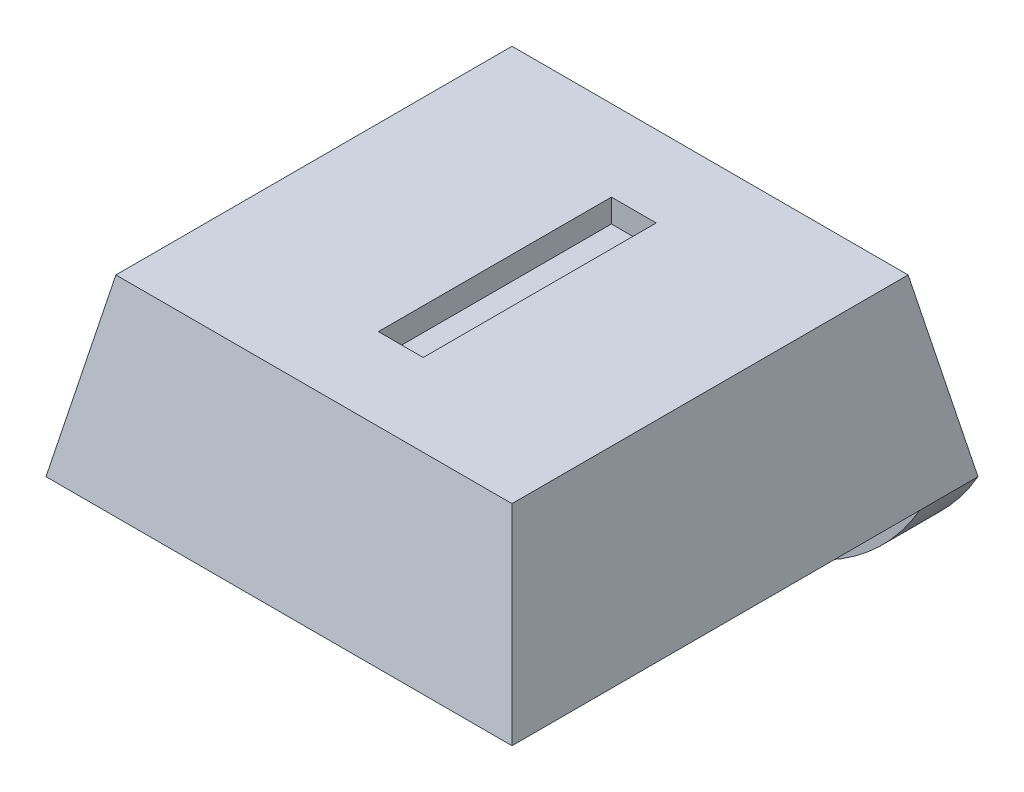
ISO-10303-21;
HEADER;
FILE_DESCRIPTION(('STEP AP214'),'2;1');
FILE_NAME('part.step','',(''),(''),'','','');
FILE_SCHEMA(('AUTOMOTIVE_DESIGN { 1 0 10303 214 1 1 1 1 }'));
ENDSEC;
DATA;
#1=APPLICATION_CONTEXT('core data for automotive mechanical design processes');
#2=APPLICATION_PROTOCOL_DEFINITION('international standard','automotive_design',2000,#1);
#3=PRODUCT_CONTEXT('',#1,'mechanical');
#4=PRODUCT('Part','Part','',(#3));
#5=PRODUCT_RELATED_PRODUCT_CATEGORY('part','',(#4));
#6=PRODUCT_DEFINITION_FORMATION('','',#4);
#7=PRODUCT_DEFINITION_CONTEXT('part definition',#1,'design');
#8=PRODUCT_DEFINITION('design','',#6,#7);
#9=PRODUCT_DEFINITION_SHAPE('','',#8);
#10=(LENGTH_UNIT() NAMED_UNIT(*) SI_UNIT(.MILLI.,.METRE.));
#11=(NAMED_UNIT(*) PLANE_ANGLE_UNIT() SI_UNIT($,.RADIAN.));
#12=(NAMED_UNIT(*) SI_UNIT($,.STERADIAN.) SOLID_ANGLE_UNIT());
#13=UNCERTAINTY_MEASURE_WITH_UNIT(LENGTH_MEASURE(1.E-05),#10,'distance_accuracy_value','');
#14=(GEOMETRIC_REPRESENTATION_CONTEXT(3) GLOBAL_UNCERTAINTY_ASSIGNED_CONTEXT((#13)) GLOBAL_UNIT_ASSIGNED_CONTEXT((#10,
#11,#12)) REPRESENTATION_CONTEXT('',''));
#15=CARTESIAN_POINT('',(0.,0.,0.));
#16=DIRECTION('',(0.,0.,1.));
#17=DIRECTION('',(1.,0.,0.));
#18=AXIS2_PLACEMENT_3D('',#15,#16,#17);
#19=CARTESIAN_POINT('',(0.,3.,0.));
#20=DIRECTION('',(0.,-1.,0.));
#21=DIRECTION('',(0.,0.,-1.));
#22=AXIS2_PLACEMENT_3D('',#19,#20,#21);
#23=PLANE('',#22);
#24=DIRECTION('',(-1.,0.,0.));
#25=VECTOR('',#24,1.);
#26=CARTESIAN_POINT('',(11.,3.,-0.6));
#27=LINE('',#26,#25);
#28=CARTESIAN_POINT('',(7.4,3.,-0.6));
#29=VERTEX_POINT('',#28);
#30=CARTESIAN_POINT('',(0.6,3.,-0.6));
#31=VERTEX_POINT('',#30);
#32=EDGE_CURVE('E180',#29,#31,#27,.T.);
#33=ORIENTED_EDGE('',*,*,#32,.F.);
#34=DIRECTION('',(0.,0.,1.));
#35=VECTOR('',#34,1.);
#36=CARTESIAN_POINT('',(7.4,3.,-8.));
#37=LINE('',#36,#35);
#38=CARTESIAN_POINT('',(7.4,3.,-7.4));
#39=VERTEX_POINT('',#38);
#40=EDGE_CURVE('E193',#39,#29,#37,.T.);
#41=ORIENTED_EDGE('',*,*,#40,.F.);
#42=DIRECTION('',(-1.,0.,0.));
#43=VECTOR('',#42,1.);
#44=CARTESIAN_POINT('',(11.,3.,-7.4));
#45=LINE('',#44,#43);
#46=CARTESIAN_POINT('',(0.599999999999999,3.,-7.4));
#47=VERTEX_POINT('',#46);
#48=EDGE_CURVE('E176',#39,#47,#45,.T.);
#49=ORIENTED_EDGE('',*,*,#48,.T.);
#50=DIRECTION('',(0.,0.,1.));
#51=VECTOR('',#50,1.);
#52=CARTESIAN_POINT('',(0.6,3.,-8.));
#53=LINE('',#52,#51);
#54=EDGE_CURVE('E196',#47,#31,#53,.T.);
#55=ORIENTED_EDGE('',*,*,#54,.T.);
#56=EDGE_LOOP('',(#33,#41,#49,#55));
#57=FACE_BOUND('',#56,.T.);
#58=DIRECTION('',(-1.,0.,0.));
#59=VECTOR('',#58,1.);
#60=CARTESIAN_POINT('',(4.46507003644335,3.,-2.0105672247147));
#61=LINE('',#60,#59);
#62=CARTESIAN_POINT('',(4.46507003644335,3.,-2.0105672247147));
#63=VERTEX_POINT('',#62);
#64=CARTESIAN_POINT('',(3.69583926721259,3.,-2.0105672247147));
#65=VERTEX_POINT('',#64);
#66=EDGE_CURVE('E58',#63,#65,#61,.T.);
#67=ORIENTED_EDGE('',*,*,#66,.T.);
#68=DIRECTION('',(0.,0.,-1.));
#69=VECTOR('',#68,1.);
#70=CARTESIAN_POINT('',(3.69583926721259,3.,-2.0105672247147));
#71=LINE('',#70,#69);
#72=CARTESIAN_POINT('',(3.69583926721259,3.,-6.0105672247147));
#73=VERTEX_POINT('',#72);
#74=EDGE_CURVE('E148',#65,#73,#71,.T.);
#75=ORIENTED_EDGE('',*,*,#74,.T.);
#76=DIRECTION('',(1.,0.,0.));
#77=VECTOR('',#76,1.);
#78=CARTESIAN_POINT('',(3.69583926721259,3.,-6.0105672247147));
#79=LINE('',#78,#77);
#80=CARTESIAN_POINT('',(4.46507003644335,3.,-6.0105672247147));
#81=VERTEX_POINT('',#80);
#82=EDGE_CURVE('E475',#73,#81,#79,.T.);
#83=ORIENTED_EDGE('',*,*,#82,.T.);
#84=DIRECTION('',(0.,0.,1.));
#85=VECTOR('',#84,1.);
#86=CARTESIAN_POINT('',(4.46507003644335,3.,-6.0105672247147));
#87=LINE('',#86,#85);
#88=EDGE_CURVE('E144',#81,#63,#87,.T.);
#89=ORIENTED_EDGE('',*,*,#88,.T.);
#90=EDGE_LOOP('',(#67,#75,#83,#89));
#91=FACE_BOUND('',#90,.T.);
#92=ADVANCED_FACE('F42',(#57,#91),#23,.F.);
#93=CARTESIAN_POINT('',(8.,0.,-8.));
#94=DIRECTION('',(-0.98058067569092,-0.196116135138184,0.));
#95=DIRECTION('',(0.196116135138184,-0.98058067569092,0.));
#96=AXIS2_PLACEMENT_3D('',#93,#94,#95);
#97=PLANE('',#96);
#98=DIRECTION('',(-0.192450089729875,0.962250448649376,-0.192450089729875));
#99=VECTOR('',#98,1.);
#100=CARTESIAN_POINT('',(7.7037037037037,1.48148148148148,-0.296296296296296));
#101=LINE('',#100,#99);
#102=CARTESIAN_POINT('',(8.,0.,0.));
#103=VERTEX_POINT('',#102);
#104=EDGE_CURVE('E190',#103,#29,#101,.T.);
#105=ORIENTED_EDGE('',*,*,#104,.F.);
#106=DIRECTION('',(0.,0.,-1.));
#107=VECTOR('',#106,1.);
#108=CARTESIAN_POINT('',(8.,0.,0.));
#109=LINE('',#108,#107);
#110=CARTESIAN_POINT('',(8.,0.,-7.));
#111=VERTEX_POINT('',#110);
#112=EDGE_CURVE('E209',#103,#111,#109,.T.);
#113=ORIENTED_EDGE('',*,*,#112,.T.);
#114=DIRECTION('',(0.,0.,1.));
#115=VECTOR('',#114,1.);
#116=CARTESIAN_POINT('',(8.,0.,-8.));
#117=LINE('',#116,#115);
#118=CARTESIAN_POINT('',(8.,0.,-8.));
#119=VERTEX_POINT('',#118);
#120=EDGE_CURVE('E150',#119,#111,#117,.T.);
#121=ORIENTED_EDGE('',*,*,#120,.F.);
#122=DIRECTION('',(0.192450089729875,-0.962250448649376,-0.192450089729875));
#123=VECTOR('',#122,1.);
#124=CARTESIAN_POINT('',(8.,0.,-8.));
#125=LINE('',#124,#123);
#126=EDGE_CURVE('E183',#39,#119,#125,.T.);
#127=ORIENTED_EDGE('',*,*,#126,.F.);
#128=ORIENTED_EDGE('',*,*,#40,.T.);
#129=EDGE_LOOP('',(#105,#113,#121,#127,#128));
#130=FACE_BOUND('',#129,.T.);
#131=ADVANCED_FACE('F277',(#130),#97,.F.);
#132=CARTESIAN_POINT('',(0.,0.,-8.));
#133=DIRECTION('',(0.98058067569092,-0.196116135138184,0.));
#134=DIRECTION('',(0.196116135138184,0.98058067569092,0.));
#135=AXIS2_PLACEMENT_3D('',#132,#133,#134);
#136=PLANE('',#135);
#137=DIRECTION('',(-0.192450089729875,-0.962250448649376,0.192450089729875));
#138=VECTOR('',#137,1.);
#139=CARTESIAN_POINT('',(0.296296296296296,1.48148148148148,-0.296296296296296));
#140=LINE('',#139,#138);
#141=CARTESIAN_POINT('',(0.,0.,0.));
#142=VERTEX_POINT('',#141);
#143=EDGE_CURVE('E237',#31,#142,#140,.T.);
#144=ORIENTED_EDGE('',*,*,#143,.F.);
#145=ORIENTED_EDGE('',*,*,#54,.F.);
#146=DIRECTION('',(0.192450089729875,0.962250448649376,0.192450089729875));
#147=VECTOR('',#146,1.);
#148=CARTESIAN_POINT('',(0.,0.,-8.));
#149=LINE('',#148,#147);
#150=CARTESIAN_POINT('',(0.,0.,-8.));
#151=VERTEX_POINT('',#150);
#152=EDGE_CURVE('E208',#151,#47,#149,.T.);
#153=ORIENTED_EDGE('',*,*,#152,.F.);
#154=DIRECTION('',(0.,0.,1.));
#155=VECTOR('',#154,1.);
#156=CARTESIAN_POINT('',(0.,0.,0.));
#157=LINE('',#156,#155);
#158=CARTESIAN_POINT('',(0.,0.,-7.));
#159=VERTEX_POINT('',#158);
#160=EDGE_CURVE('E213',#151,#159,#157,.T.);
#161=ORIENTED_EDGE('',*,*,#160,.T.);
#162=EDGE_CURVE('E200',#159,#142,#157,.T.);
#163=ORIENTED_EDGE('',*,*,#162,.T.);
#164=EDGE_LOOP('',(#144,#145,#153,#161,#163));
#165=FACE_BOUND('',#164,.T.);
#166=ADVANCED_FACE('F261',(#165),#136,.F.);
#167=CARTESIAN_POINT('',(0.,0.,0.));
#168=DIRECTION('',(0.,-1.,0.));
#169=DIRECTION('',(0.,0.,-1.));
#170=AXIS2_PLACEMENT_3D('',#167,#168,#169);
#171=PLANE('',#170);
#172=DIRECTION('',(-1.,0.,0.));
#173=VECTOR('',#172,1.);
#174=CARTESIAN_POINT('',(0.,0.,-7.));
#175=LINE('',#174,#173);
#176=EDGE_CURVE('E156',#111,#159,#175,.T.);
#177=ORIENTED_EDGE('',*,*,#176,.F.);
#178=ORIENTED_EDGE('',*,*,#112,.F.);
#179=DIRECTION('',(1.,0.,0.));
#180=VECTOR('',#179,1.);
#181=CARTESIAN_POINT('',(0.,0.,0.));
#182=LINE('',#181,#180);
#183=EDGE_CURVE('E210',#142,#103,#182,.T.);
#184=ORIENTED_EDGE('',*,*,#183,.F.);
#185=ORIENTED_EDGE('',*,*,#162,.F.);
#186=EDGE_LOOP('',(#177,#178,#184,#185));
#187=FACE_BOUND('',#186,.T.);
#188=CARTESIAN_POINT('',(4.,0.,-3.75));
#189=DIRECTION('',(0.,-1.,0.));
#190=DIRECTION('',(0.,0.,-1.));
#191=AXIS2_PLACEMENT_3D('',#188,#189,#190);
#192=CIRCLE('',#191,1.8);
#193=CARTESIAN_POINT('',(4.,0.,-5.55));
#194=VERTEX_POINT('',#193);
#195=EDGE_CURVE('E168',#194,#194,#192,.T.);
#196=ORIENTED_EDGE('',*,*,#195,.F.);
#197=EDGE_LOOP('',(#196));
#198=FACE_BOUND('',#197,.T.);
#199=ADVANCED_FACE('F272',(#187,#198),#171,.T.);
#200=CARTESIAN_POINT('',(11.,3.,-7.4));
#201=DIRECTION('',(0.,0.196116135138184,-0.98058067569092));
#202=DIRECTION('',(0.,0.98058067569092,0.196116135138184));
#203=AXIS2_PLACEMENT_3D('',#200,#201,#202);
#204=PLANE('',#203);
#205=ORIENTED_EDGE('',*,*,#126,.T.);
#206=DIRECTION('',(-1.,0.,0.));
#207=VECTOR('',#206,1.);
#208=CARTESIAN_POINT('',(0.,0.,-8.));
#209=LINE('',#208,#207);
#210=EDGE_CURVE('E204',#119,#151,#209,.T.);
#211=ORIENTED_EDGE('',*,*,#210,.T.);
#212=ORIENTED_EDGE('',*,*,#152,.T.);
#213=ORIENTED_EDGE('',*,*,#48,.F.);
#214=EDGE_LOOP('',(#205,#211,#212,#213));
#215=FACE_BOUND('',#214,.T.);
#216=ADVANCED_FACE('F256',(#215),#204,.T.);
#217=CARTESIAN_POINT('',(11.,0.,0.));
#218=DIRECTION('',(0.,0.196116135138184,0.98058067569092));
#219=DIRECTION('',(0.,-0.98058067569092,0.196116135138184));
#220=AXIS2_PLACEMENT_3D('',#217,#218,#219);
#221=PLANE('',#220);
#222=ORIENTED_EDGE('',*,*,#104,.T.);
#223=ORIENTED_EDGE('',*,*,#32,.T.);
#224=ORIENTED_EDGE('',*,*,#143,.T.);
#225=ORIENTED_EDGE('',*,*,#183,.T.);
#226=EDGE_LOOP('',(#222,#223,#224,#225));
#227=FACE_BOUND('',#226,.T.);
#228=ADVANCED_FACE('F303',(#227),#221,.T.);
#229=CARTESIAN_POINT('',(4.,0.8,-3.75));
#230=DIRECTION('',(0.,-1.,0.));
#231=DIRECTION('',(0.,0.,-1.));
#232=AXIS2_PLACEMENT_3D('',#229,#230,#231);
#233=CYLINDRICAL_SURFACE('',#232,1.8);
#234=CARTESIAN_POINT('',(4.,0.8,-3.75));
#235=DIRECTION('',(0.,-1.,0.));
#236=DIRECTION('',(0.,0.,-1.));
#237=AXIS2_PLACEMENT_3D('',#234,#235,#236);
#238=CIRCLE('',#237,1.8);
#239=CARTESIAN_POINT('',(4.,0.8,-5.55));
#240=VERTEX_POINT('',#239);
#241=EDGE_CURVE('E172',#240,#240,#238,.T.);
#242=ORIENTED_EDGE('',*,*,#241,.F.);
#243=EDGE_LOOP('',(#242));
#244=FACE_BOUND('',#243,.T.);
#245=ORIENTED_EDGE('',*,*,#195,.T.);
#246=EDGE_LOOP('',(#245));
#247=FACE_BOUND('',#246,.T.);
#248=ADVANCED_FACE('F310',(#244,#247),#233,.F.);
#249=CARTESIAN_POINT('',(4.,0.8,-3.75));
#250=DIRECTION('',(0.,-1.,0.));
#251=DIRECTION('',(0.,0.,-1.));
#252=AXIS2_PLACEMENT_3D('',#249,#250,#251);
#253=PLANE('',#252);
#254=ORIENTED_EDGE('',*,*,#241,.T.);
#255=EDGE_LOOP('',(#254));
#256=FACE_BOUND('',#255,.T.);
#257=ADVANCED_FACE('F314',(#256),#253,.T.);
#258=CARTESIAN_POINT('',(0.,-2.,-8.));
#259=DIRECTION('',(0.,0.,1.));
#260=DIRECTION('',(1.,0.,0.));
#261=AXIS2_PLACEMENT_3D('',#258,#259,#260);
#262=PLANE('',#261);
#263=ORIENTED_EDGE('',*,*,#210,.F.);
#264=CARTESIAN_POINT('',(4.53589838486225,2.,-8.));
#265=DIRECTION('',(0.,0.,1.));
#266=DIRECTION('',(1.,0.,0.));
#267=AXIS2_PLACEMENT_3D('',#264,#265,#266);
#268=CIRCLE('',#267,4.);
#269=CARTESIAN_POINT('',(4.53589838486225,-2.,-8.));
#270=VERTEX_POINT('',#269);
#271=EDGE_CURVE('E11',#119,#270,#268,.F.);
#272=ORIENTED_EDGE('',*,*,#271,.T.);
#273=DIRECTION('',(1.,0.,0.));
#274=VECTOR('',#273,1.);
#275=CARTESIAN_POINT('',(0.,-2.,-8.));
#276=LINE('',#275,#274);
#277=CARTESIAN_POINT('',(3.46410161513775,-2.,-8.));
#278=VERTEX_POINT('',#277);
#279=EDGE_CURVE('E162',#278,#270,#276,.T.);
#280=ORIENTED_EDGE('',*,*,#279,.F.);
#281=CARTESIAN_POINT('',(3.46410161513775,2.,-8.));
#282=DIRECTION('',(0.,0.,1.));
#283=DIRECTION('',(1.,0.,0.));
#284=AXIS2_PLACEMENT_3D('',#281,#282,#283);
#285=CIRCLE('',#284,4.);
#286=EDGE_CURVE('E51',#278,#151,#285,.F.);
#287=ORIENTED_EDGE('',*,*,#286,.T.);
#288=EDGE_LOOP('',(#263,#272,#280,#287));
#289=FACE_BOUND('',#288,.T.);
#290=ADVANCED_FACE('F249',(#289),#262,.F.);
#291=CARTESIAN_POINT('',(0.,-2.,-7.));
#292=DIRECTION('',(0.,0.,-1.));
#293=DIRECTION('',(-1.,0.,0.));
#294=AXIS2_PLACEMENT_3D('',#291,#292,#293);
#295=PLANE('',#294);
#296=DIRECTION('',(-1.,0.,0.));
#297=VECTOR('',#296,1.);
#298=CARTESIAN_POINT('',(0.,-2.,-7.));
#299=LINE('',#298,#297);
#300=CARTESIAN_POINT('',(4.53589838486225,-2.,-7.));
#301=VERTEX_POINT('',#300);
#302=CARTESIAN_POINT('',(3.46410161513775,-2.,-7.));
#303=VERTEX_POINT('',#302);
#304=EDGE_CURVE('E166',#301,#303,#299,.T.);
#305=ORIENTED_EDGE('',*,*,#304,.F.);
#306=CARTESIAN_POINT('',(4.53589838486225,2.,-7.));
#307=DIRECTION('',(0.,0.,-1.));
#308=DIRECTION('',(-1.,0.,0.));
#309=AXIS2_PLACEMENT_3D('',#306,#307,#308);
#310=CIRCLE('',#309,4.);
#311=EDGE_CURVE('E243',#301,#111,#310,.F.);
#312=ORIENTED_EDGE('',*,*,#311,.T.);
#313=ORIENTED_EDGE('',*,*,#176,.T.);
#314=CARTESIAN_POINT('',(3.46410161513775,2.,-7.));
#315=DIRECTION('',(0.,0.,-1.));
#316=DIRECTION('',(-1.,0.,0.));
#317=AXIS2_PLACEMENT_3D('',#314,#315,#316);
#318=CIRCLE('',#317,4.);
#319=EDGE_CURVE('E66',#159,#303,#318,.F.);
#320=ORIENTED_EDGE('',*,*,#319,.T.);
#321=EDGE_LOOP('',(#305,#312,#313,#320));
#322=FACE_BOUND('',#321,.T.);
#323=ADVANCED_FACE('F267',(#322),#295,.F.);
#324=CARTESIAN_POINT('',(0.,-2.,0.));
#325=DIRECTION('',(0.,1.,0.));
#326=DIRECTION('',(0.,0.,1.));
#327=AXIS2_PLACEMENT_3D('',#324,#325,#326);
#328=PLANE('',#327);
#329=ORIENTED_EDGE('',*,*,#279,.T.);
#330=DIRECTION('',(0.,0.,1.));
#331=VECTOR('',#330,1.);
#332=CARTESIAN_POINT('',(4.53589838486225,-2.,0.));
#333=LINE('',#332,#331);
#334=EDGE_CURVE('E236',#270,#301,#333,.T.);
#335=ORIENTED_EDGE('',*,*,#334,.T.);
#336=ORIENTED_EDGE('',*,*,#304,.T.);
#337=DIRECTION('',(0.,0.,-1.));
#338=VECTOR('',#337,1.);
#339=CARTESIAN_POINT('',(3.46410161513775,-2.,0.));
#340=LINE('',#339,#338);
#341=EDGE_CURVE('E232',#303,#278,#340,.T.);
#342=ORIENTED_EDGE('',*,*,#341,.T.);
#343=EDGE_LOOP('',(#329,#335,#336,#342));
#344=FACE_BOUND('',#343,.T.);
#345=ADVANCED_FACE('F265',(#344),#328,.F.);
#346=CARTESIAN_POINT('',(4.53589838486225,2.,-8.));
#347=DIRECTION('',(0.,0.,1.));
#348=DIRECTION('',(1.,0.,0.));
#349=AXIS2_PLACEMENT_3D('',#346,#347,#348);
#350=CYLINDRICAL_SURFACE('',#349,4.);
#351=ORIENTED_EDGE('',*,*,#271,.F.);
#352=ORIENTED_EDGE('',*,*,#120,.T.);
#353=ORIENTED_EDGE('',*,*,#311,.F.);
#354=ORIENTED_EDGE('',*,*,#334,.F.);
#355=EDGE_LOOP('',(#351,#352,#353,#354));
#356=FACE_BOUND('',#355,.T.);
#357=ADVANCED_FACE('F278',(#356),#350,.T.);
#358=CARTESIAN_POINT('',(3.46410161513775,2.,-8.));
#359=DIRECTION('',(0.,0.,-1.));
#360=DIRECTION('',(-1.,0.,0.));
#361=AXIS2_PLACEMENT_3D('',#358,#359,#360);
#362=CYLINDRICAL_SURFACE('',#361,4.);
#363=ORIENTED_EDGE('',*,*,#319,.F.);
#364=ORIENTED_EDGE('',*,*,#160,.F.);
#365=ORIENTED_EDGE('',*,*,#286,.F.);
#366=ORIENTED_EDGE('',*,*,#341,.F.);
#367=EDGE_LOOP('',(#363,#364,#365,#366));
#368=FACE_BOUND('',#367,.T.);
#369=ADVANCED_FACE('F44',(#368),#362,.T.);
#370=CARTESIAN_POINT('',(4.46507003644335,2.6,-2.0105672247147));
#371=DIRECTION('',(0.,0.,-1.));
#372=DIRECTION('',(-1.,0.,0.));
#373=AXIS2_PLACEMENT_3D('',#370,#371,#372);
#374=PLANE('',#373);
#375=ORIENTED_EDGE('',*,*,#66,.F.);
#376=DIRECTION('',(0.,1.,0.));
#377=VECTOR('',#376,1.);
#378=CARTESIAN_POINT('',(4.46507003644335,2.6,-2.0105672247147));
#379=LINE('',#378,#377);
#380=CARTESIAN_POINT('',(4.46507003644335,2.6,-2.0105672247147));
#381=VERTEX_POINT('',#380);
#382=EDGE_CURVE('E142',#381,#63,#379,.T.);
#383=ORIENTED_EDGE('',*,*,#382,.F.);
#384=DIRECTION('',(-1.,0.,0.));
#385=VECTOR('',#384,1.);
#386=CARTESIAN_POINT('',(4.46507003644335,2.6,-2.0105672247147));
#387=LINE('',#386,#385);
#388=CARTESIAN_POINT('',(3.69583926721259,2.6,-2.0105672247147));
#389=VERTEX_POINT('',#388);
#390=EDGE_CURVE('E133',#381,#389,#387,.T.);
#391=ORIENTED_EDGE('',*,*,#390,.T.);
#392=DIRECTION('',(0.,1.,0.));
#393=VECTOR('',#392,1.);
#394=CARTESIAN_POINT('',(3.69583926721259,2.6,-2.0105672247147));
#395=LINE('',#394,#393);
#396=EDGE_CURVE('E141',#389,#65,#395,.T.);
#397=ORIENTED_EDGE('',*,*,#396,.T.);
#398=EDGE_LOOP('',(#375,#383,#391,#397));
#399=FACE_BOUND('',#398,.T.);
#400=ADVANCED_FACE('F140',(#399),#374,.T.);
#401=CARTESIAN_POINT('',(3.69583926721259,2.6,-2.0105672247147));
#402=DIRECTION('',(1.,0.,0.));
#403=DIRECTION('',(0.,0.,-1.));
#404=AXIS2_PLACEMENT_3D('',#401,#402,#403);
#405=PLANE('',#404);
#406=ORIENTED_EDGE('',*,*,#74,.F.);
#407=ORIENTED_EDGE('',*,*,#396,.F.);
#408=DIRECTION('',(0.,0.,-1.));
#409=VECTOR('',#408,1.);
#410=CARTESIAN_POINT('',(3.69583926721259,2.6,-2.0105672247147));
#411=LINE('',#410,#409);
#412=CARTESIAN_POINT('',(3.69583926721259,2.6,-6.0105672247147));
#413=VERTEX_POINT('',#412);
#414=EDGE_CURVE('E129',#389,#413,#411,.T.);
#415=ORIENTED_EDGE('',*,*,#414,.T.);
#416=DIRECTION('',(0.,1.,0.));
#417=VECTOR('',#416,1.);
#418=CARTESIAN_POINT('',(3.69583926721259,2.6,-6.0105672247147));
#419=LINE('',#418,#417);
#420=EDGE_CURVE('E151',#413,#73,#419,.T.);
#421=ORIENTED_EDGE('',*,*,#420,.T.);
#422=EDGE_LOOP('',(#406,#407,#415,#421));
#423=FACE_BOUND('',#422,.T.);
#424=ADVANCED_FACE('F146',(#423),#405,.T.);
#425=CARTESIAN_POINT('',(3.69583926721259,2.6,-6.0105672247147));
#426=DIRECTION('',(0.,0.,1.));
#427=DIRECTION('',(1.,0.,0.));
#428=AXIS2_PLACEMENT_3D('',#425,#426,#427);
#429=PLANE('',#428);
#430=ORIENTED_EDGE('',*,*,#82,.F.);
#431=ORIENTED_EDGE('',*,*,#420,.F.);
#432=DIRECTION('',(1.,0.,0.));
#433=VECTOR('',#432,1.);
#434=CARTESIAN_POINT('',(3.69583926721259,2.6,-6.0105672247147));
#435=LINE('',#434,#433);
#436=CARTESIAN_POINT('',(4.46507003644335,2.6,-6.0105672247147));
#437=VERTEX_POINT('',#436);
#438=EDGE_CURVE('E134',#413,#437,#435,.T.);
#439=ORIENTED_EDGE('',*,*,#438,.T.);
#440=DIRECTION('',(0.,1.,0.));
#441=VECTOR('',#440,1.);
#442=CARTESIAN_POINT('',(4.46507003644335,2.6,-6.0105672247147));
#443=LINE('',#442,#441);
#444=EDGE_CURVE('E158',#437,#81,#443,.T.);
#445=ORIENTED_EDGE('',*,*,#444,.T.);
#446=EDGE_LOOP('',(#430,#431,#439,#445));
#447=FACE_BOUND('',#446,.T.);
#448=ADVANCED_FACE('F327',(#447),#429,.T.);
#449=CARTESIAN_POINT('',(4.46507003644335,2.6,-6.0105672247147));
#450=DIRECTION('',(-1.,0.,0.));
#451=DIRECTION('',(0.,0.,1.));
#452=AXIS2_PLACEMENT_3D('',#449,#450,#451);
#453=PLANE('',#452);
#454=ORIENTED_EDGE('',*,*,#88,.F.);
#455=ORIENTED_EDGE('',*,*,#444,.F.);
#456=DIRECTION('',(0.,0.,1.));
#457=VECTOR('',#456,1.);
#458=CARTESIAN_POINT('',(4.46507003644335,2.6,-6.0105672247147));
#459=LINE('',#458,#457);
#460=EDGE_CURVE('E485',#437,#381,#459,.T.);
#461=ORIENTED_EDGE('',*,*,#460,.T.);
#462=ORIENTED_EDGE('',*,*,#382,.T.);
#463=EDGE_LOOP('',(#454,#455,#461,#462));
#464=FACE_BOUND('',#463,.T.);
#465=ADVANCED_FACE('F330',(#464),#453,.T.);
#466=CARTESIAN_POINT('',(0.,2.6,0.));
#467=DIRECTION('',(0.,-1.,0.));
#468=DIRECTION('',(0.,0.,-1.));
#469=AXIS2_PLACEMENT_3D('',#466,#467,#468);
#470=PLANE('',#469);
#471=ORIENTED_EDGE('',*,*,#390,.F.);
#472=ORIENTED_EDGE('',*,*,#460,.F.);
#473=ORIENTED_EDGE('',*,*,#438,.F.);
#474=ORIENTED_EDGE('',*,*,#414,.F.);
#475=EDGE_LOOP('',(#471,#472,#473,#474));
#476=FACE_BOUND('',#475,.T.);
#477=ADVANCED_FACE('F131',(#476),#470,.F.);
#478=CLOSED_SHELL('',(#92,#131,#166,#199,#216,#228,#248,#257,#290,#323,#345,#357,#369,#400,#424,
#448,#465,#477));
#479=MANIFOLD_SOLID_BREP('B2',#478);
#480=ADVANCED_BREP_SHAPE_REPRESENTATION('',(#18,#479),#14);
#481=SHAPE_DEFINITION_REPRESENTATION(#9,#480);
ENDSEC;
END-ISO-10303-21;
